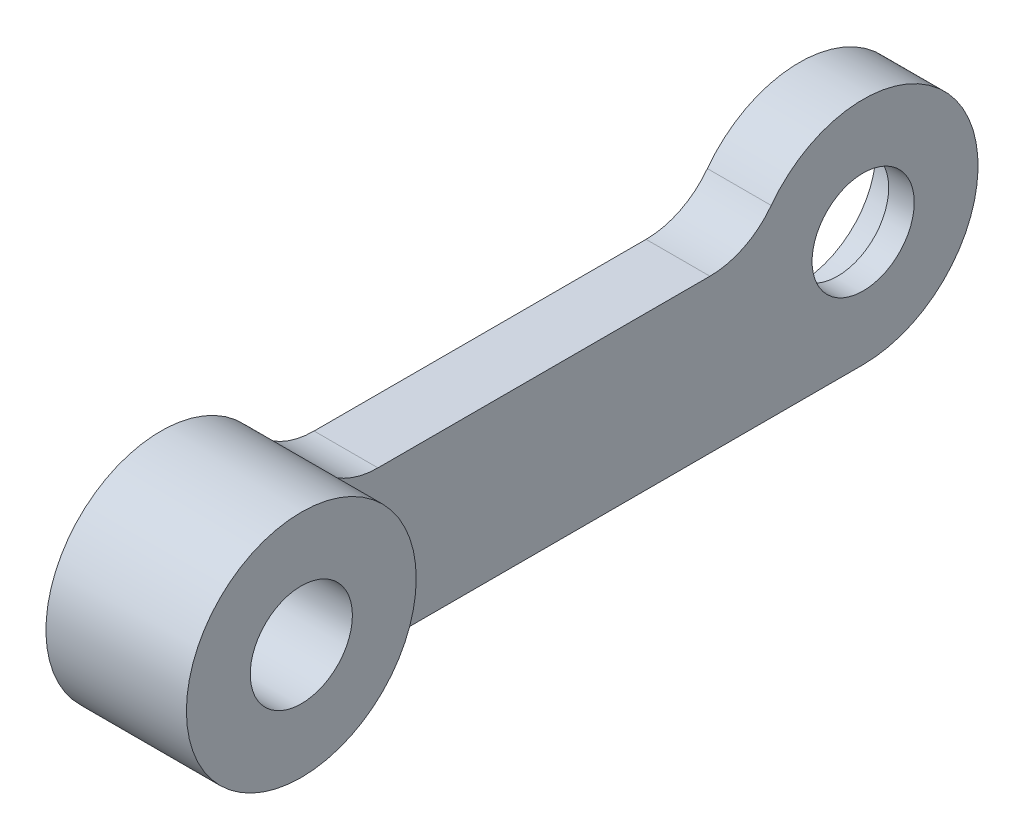
ISO-10303-21;
HEADER;
FILE_DESCRIPTION(('STEP AP214'),'2;1');
FILE_NAME('part.step','',(''),(''),'','','');
FILE_SCHEMA(('AUTOMOTIVE_DESIGN { 1 0 10303 214 1 1 1 1 }'));
ENDSEC;
DATA;
#1=APPLICATION_CONTEXT('core data for automotive mechanical design processes');
#2=APPLICATION_PROTOCOL_DEFINITION('international standard','automotive_design',2000,#1);
#3=PRODUCT_CONTEXT('',#1,'mechanical');
#4=PRODUCT('Part','Part','',(#3));
#5=PRODUCT_RELATED_PRODUCT_CATEGORY('part','',(#4));
#6=PRODUCT_DEFINITION_FORMATION('','',#4);
#7=PRODUCT_DEFINITION_CONTEXT('part definition',#1,'design');
#8=PRODUCT_DEFINITION('design','',#6,#7);
#9=PRODUCT_DEFINITION_SHAPE('','',#8);
#10=(LENGTH_UNIT() NAMED_UNIT(*) SI_UNIT(.MILLI.,.METRE.));
#11=(NAMED_UNIT(*) PLANE_ANGLE_UNIT() SI_UNIT($,.RADIAN.));
#12=(NAMED_UNIT(*) SI_UNIT($,.STERADIAN.) SOLID_ANGLE_UNIT());
#13=UNCERTAINTY_MEASURE_WITH_UNIT(LENGTH_MEASURE(1.E-05),#10,'distance_accuracy_value','');
#14=(GEOMETRIC_REPRESENTATION_CONTEXT(3) GLOBAL_UNCERTAINTY_ASSIGNED_CONTEXT((#13)) GLOBAL_UNIT_ASSIGNED_CONTEXT((#10,
#11,#12)) REPRESENTATION_CONTEXT('',''));
#15=CARTESIAN_POINT('',(0.,0.,0.));
#16=DIRECTION('',(0.,0.,1.));
#17=DIRECTION('',(1.,0.,0.));
#18=AXIS2_PLACEMENT_3D('',#15,#16,#17);
#19=CARTESIAN_POINT('',(4.5,-1.5,0.));
#20=DIRECTION('',(1.,0.,0.));
#21=DIRECTION('',(0.,0.,1.));
#22=AXIS2_PLACEMENT_3D('',#19,#20,#21);
#23=CYLINDRICAL_SURFACE('',#22,2.);
#24=CARTESIAN_POINT('',(10.,-1.5,0.));
#25=DIRECTION('',(1.,0.,0.));
#26=DIRECTION('',(0.,0.,-1.));
#27=AXIS2_PLACEMENT_3D('',#24,#25,#26);
#28=CIRCLE('',#27,2.);
#29=CARTESIAN_POINT('',(10.,-1.5,-2.));
#30=VERTEX_POINT('',#29);
#31=EDGE_CURVE('E162',#30,#30,#28,.T.);
#32=ORIENTED_EDGE('',*,*,#31,.T.);
#33=EDGE_LOOP('',(#32));
#34=FACE_BOUND('',#33,.T.);
#35=CARTESIAN_POINT('',(6.,-1.5,0.));
#36=DIRECTION('',(1.,0.,0.));
#37=DIRECTION('',(0.,0.,-1.));
#38=AXIS2_PLACEMENT_3D('',#35,#36,#37);
#39=CIRCLE('',#38,2.);
#40=CARTESIAN_POINT('',(6.,-1.5,-2.));
#41=VERTEX_POINT('',#40);
#42=EDGE_CURVE('E72',#41,#41,#39,.T.);
#43=ORIENTED_EDGE('',*,*,#42,.F.);
#44=EDGE_LOOP('',(#43));
#45=FACE_BOUND('',#44,.T.);
#46=ADVANCED_FACE('F68',(#34,#45),#23,.F.);
#47=CARTESIAN_POINT('',(4.5,-1.5,-25.));
#48=DIRECTION('',(1.,0.,0.));
#49=DIRECTION('',(0.,0.,1.));
#50=AXIS2_PLACEMENT_3D('',#47,#48,#49);
#51=CYLINDRICAL_SURFACE('',#50,2.);
#52=CARTESIAN_POINT('',(7.,-1.5,-25.));
#53=DIRECTION('',(1.,0.,0.));
#54=DIRECTION('',(0.,0.,-1.));
#55=AXIS2_PLACEMENT_3D('',#52,#53,#54);
#56=CIRCLE('',#55,2.);
#57=CARTESIAN_POINT('',(7.,-1.5,-27.));
#58=VERTEX_POINT('',#57);
#59=EDGE_CURVE('E159',#58,#58,#56,.F.);
#60=ORIENTED_EDGE('',*,*,#59,.F.);
#61=EDGE_LOOP('',(#60));
#62=FACE_BOUND('',#61,.T.);
#63=CARTESIAN_POINT('',(6.,-1.5,-25.));
#64=DIRECTION('',(1.,0.,0.));
#65=DIRECTION('',(0.,0.,-1.));
#66=AXIS2_PLACEMENT_3D('',#63,#64,#65);
#67=CIRCLE('',#66,2.);
#68=CARTESIAN_POINT('',(6.,-1.5,-27.));
#69=VERTEX_POINT('',#68);
#70=EDGE_CURVE('E175',#69,#69,#67,.T.);
#71=ORIENTED_EDGE('',*,*,#70,.F.);
#72=EDGE_LOOP('',(#71));
#73=FACE_BOUND('',#72,.T.);
#74=ADVANCED_FACE('F211',(#62,#73),#51,.F.);
#75=CARTESIAN_POINT('',(4.5,-1.5,0.));
#76=DIRECTION('',(-1.,0.,0.));
#77=DIRECTION('',(0.,0.,-1.));
#78=AXIS2_PLACEMENT_3D('',#75,#76,#77);
#79=PLANE('',#78);
#80=CARTESIAN_POINT('',(4.5,-1.5,0.));
#81=DIRECTION('',(1.,0.,0.));
#82=DIRECTION('',(0.,0.,-1.));
#83=AXIS2_PLACEMENT_3D('',#80,#81,#82);
#84=CIRCLE('',#83,3.);
#85=CARTESIAN_POINT('',(4.5,-1.5,-3.));
#86=VERTEX_POINT('',#85);
#87=EDGE_CURVE('E182',#86,#86,#84,.T.);
#88=ORIENTED_EDGE('',*,*,#87,.T.);
#89=EDGE_LOOP('',(#88));
#90=FACE_BOUND('',#89,.T.);
#91=CARTESIAN_POINT('',(4.5,-1.5,-25.));
#92=DIRECTION('',(1.,0.,0.));
#93=DIRECTION('',(0.,0.,-1.));
#94=AXIS2_PLACEMENT_3D('',#91,#92,#93);
#95=CIRCLE('',#94,3.);
#96=CARTESIAN_POINT('',(4.5,-1.5,-28.));
#97=VERTEX_POINT('',#96);
#98=EDGE_CURVE('E192',#97,#97,#95,.T.);
#99=ORIENTED_EDGE('',*,*,#98,.T.);
#100=EDGE_LOOP('',(#99));
#101=FACE_BOUND('',#100,.T.);
#102=DIRECTION('',(0.,0.,-1.));
#103=VECTOR('',#102,1.);
#104=CARTESIAN_POINT('',(4.5,-6.,0.));
#105=LINE('',#104,#103);
#106=CARTESIAN_POINT('',(4.5,-6.,0.));
#107=VERTEX_POINT('',#106);
#108=CARTESIAN_POINT('',(4.5,-6.,-25.));
#109=VERTEX_POINT('',#108);
#110=EDGE_CURVE('E146',#107,#109,#105,.T.);
#111=ORIENTED_EDGE('',*,*,#110,.F.);
#112=CARTESIAN_POINT('',(4.5,-1.5,0.));
#113=DIRECTION('',(1.,0.,0.));
#114=DIRECTION('',(0.,0.,-1.));
#115=AXIS2_PLACEMENT_3D('',#112,#113,#114);
#116=CIRCLE('',#115,4.5);
#117=CARTESIAN_POINT('',(4.5,1.2,-3.6));
#118=VERTEX_POINT('',#117);
#119=EDGE_CURVE('E141',#118,#107,#116,.T.);
#120=ORIENTED_EDGE('',*,*,#119,.F.);
#121=CARTESIAN_POINT('',(4.5,3.,-6.));
#122=DIRECTION('',(1.,0.,0.));
#123=DIRECTION('',(0.,0.,-1.));
#124=AXIS2_PLACEMENT_3D('',#121,#122,#123);
#125=CIRCLE('',#124,3.);
#126=CARTESIAN_POINT('',(4.5,0.,-6.));
#127=VERTEX_POINT('',#126);
#128=EDGE_CURVE('E12',#127,#118,#125,.F.);
#129=ORIENTED_EDGE('',*,*,#128,.F.);
#130=DIRECTION('',(0.,0.,-1.));
#131=VECTOR('',#130,1.);
#132=CARTESIAN_POINT('',(4.5,0.,0.));
#133=LINE('',#132,#131);
#134=CARTESIAN_POINT('',(4.5,0.,-19.));
#135=VERTEX_POINT('',#134);
#136=EDGE_CURVE('E148',#127,#135,#133,.T.);
#137=ORIENTED_EDGE('',*,*,#136,.T.);
#138=CARTESIAN_POINT('',(4.5,3.,-19.));
#139=DIRECTION('',(1.,0.,0.));
#140=DIRECTION('',(0.,0.,-1.));
#141=AXIS2_PLACEMENT_3D('',#138,#139,#140);
#142=CIRCLE('',#141,3.);
#143=CARTESIAN_POINT('',(4.5,1.2,-21.4));
#144=VERTEX_POINT('',#143);
#145=EDGE_CURVE('E172',#144,#135,#142,.F.);
#146=ORIENTED_EDGE('',*,*,#145,.F.);
#147=CARTESIAN_POINT('',(4.5,-1.5,-25.));
#148=DIRECTION('',(1.,0.,0.));
#149=DIRECTION('',(0.,0.,-1.));
#150=AXIS2_PLACEMENT_3D('',#147,#148,#149);
#151=CIRCLE('',#150,4.5);
#152=EDGE_CURVE('E132',#109,#144,#151,.T.);
#153=ORIENTED_EDGE('',*,*,#152,.F.);
#154=EDGE_LOOP('',(#111,#120,#129,#137,#146,#153));
#155=FACE_BOUND('',#154,.T.);
#156=ADVANCED_FACE('F202',(#90,#101,#155),#79,.T.);
#157=CARTESIAN_POINT('',(4.5,-1.5,0.));
#158=DIRECTION('',(1.,0.,0.));
#159=DIRECTION('',(0.,0.,1.));
#160=AXIS2_PLACEMENT_3D('',#157,#158,#159);
#161=CYLINDRICAL_SURFACE('',#160,4.5);
#162=ORIENTED_EDGE('',*,*,#119,.T.);
#163=DIRECTION('',(1.,0.,0.));
#164=VECTOR('',#163,1.);
#165=CARTESIAN_POINT('',(4.5,-6.,0.));
#166=LINE('',#165,#164);
#167=CARTESIAN_POINT('',(7.,-6.,0.));
#168=VERTEX_POINT('',#167);
#169=EDGE_CURVE('E127',#107,#168,#166,.T.);
#170=ORIENTED_EDGE('',*,*,#169,.T.);
#171=CARTESIAN_POINT('',(7.,-1.5,0.));
#172=DIRECTION('',(1.,0.,0.));
#173=DIRECTION('',(0.,0.,-1.));
#174=AXIS2_PLACEMENT_3D('',#171,#172,#173);
#175=CIRCLE('',#174,4.5);
#176=CARTESIAN_POINT('',(7.,1.2,-3.6));
#177=VERTEX_POINT('',#176);
#178=EDGE_CURVE('E134',#168,#177,#175,.T.);
#179=ORIENTED_EDGE('',*,*,#178,.T.);
#180=DIRECTION('',(1.,0.,0.));
#181=VECTOR('',#180,1.);
#182=CARTESIAN_POINT('',(4.5,1.2,-3.6));
#183=LINE('',#182,#181);
#184=EDGE_CURVE('E91',#118,#177,#183,.T.);
#185=ORIENTED_EDGE('',*,*,#184,.F.);
#186=EDGE_LOOP('',(#162,#170,#179,#185));
#187=FACE_BOUND('',#186,.T.);
#188=CARTESIAN_POINT('',(10.,-1.5,0.));
#189=DIRECTION('',(1.,0.,0.));
#190=DIRECTION('',(0.,0.,-1.));
#191=AXIS2_PLACEMENT_3D('',#188,#189,#190);
#192=CIRCLE('',#191,4.5);
#193=CARTESIAN_POINT('',(10.,-1.5,-4.5));
#194=VERTEX_POINT('',#193);
#195=EDGE_CURVE('E158',#194,#194,#192,.T.);
#196=ORIENTED_EDGE('',*,*,#195,.F.);
#197=EDGE_LOOP('',(#196));
#198=FACE_BOUND('',#197,.T.);
#199=ADVANCED_FACE('F138',(#187,#198),#161,.T.);
#200=CARTESIAN_POINT('',(7.,-1.5,0.));
#201=DIRECTION('',(-1.,0.,0.));
#202=DIRECTION('',(0.,0.,-1.));
#203=AXIS2_PLACEMENT_3D('',#200,#201,#202);
#204=PLANE('',#203);
#205=ORIENTED_EDGE('',*,*,#59,.T.);
#206=EDGE_LOOP('',(#205));
#207=FACE_BOUND('',#206,.T.);
#208=DIRECTION('',(0.,0.,-1.));
#209=VECTOR('',#208,1.);
#210=CARTESIAN_POINT('',(7.,-6.,0.));
#211=LINE('',#210,#209);
#212=CARTESIAN_POINT('',(7.,-6.,-25.));
#213=VERTEX_POINT('',#212);
#214=EDGE_CURVE('E123',#168,#213,#211,.T.);
#215=ORIENTED_EDGE('',*,*,#214,.T.);
#216=CARTESIAN_POINT('',(7.,-1.5,-25.));
#217=DIRECTION('',(1.,0.,0.));
#218=DIRECTION('',(0.,0.,-1.));
#219=AXIS2_PLACEMENT_3D('',#216,#217,#218);
#220=CIRCLE('',#219,4.5);
#221=CARTESIAN_POINT('',(7.,1.2,-21.4));
#222=VERTEX_POINT('',#221);
#223=EDGE_CURVE('E156',#213,#222,#220,.T.);
#224=ORIENTED_EDGE('',*,*,#223,.T.);
#225=CARTESIAN_POINT('',(7.,3.,-19.));
#226=DIRECTION('',(1.,0.,0.));
#227=DIRECTION('',(0.,0.,-1.));
#228=AXIS2_PLACEMENT_3D('',#225,#226,#227);
#229=CIRCLE('',#228,3.);
#230=CARTESIAN_POINT('',(7.,0.,-19.));
#231=VERTEX_POINT('',#230);
#232=EDGE_CURVE('E169',#231,#222,#229,.T.);
#233=ORIENTED_EDGE('',*,*,#232,.F.);
#234=DIRECTION('',(0.,0.,-1.));
#235=VECTOR('',#234,1.);
#236=CARTESIAN_POINT('',(7.,0.,0.));
#237=LINE('',#236,#235);
#238=CARTESIAN_POINT('',(7.,0.,-6.));
#239=VERTEX_POINT('',#238);
#240=EDGE_CURVE('E131',#239,#231,#237,.T.);
#241=ORIENTED_EDGE('',*,*,#240,.F.);
#242=CARTESIAN_POINT('',(7.,3.,-6.));
#243=DIRECTION('',(1.,0.,0.));
#244=DIRECTION('',(0.,0.,-1.));
#245=AXIS2_PLACEMENT_3D('',#242,#243,#244);
#246=CIRCLE('',#245,3.);
#247=EDGE_CURVE('E77',#177,#239,#246,.T.);
#248=ORIENTED_EDGE('',*,*,#247,.F.);
#249=ORIENTED_EDGE('',*,*,#178,.F.);
#250=EDGE_LOOP('',(#215,#224,#233,#241,#248,#249));
#251=FACE_BOUND('',#250,.T.);
#252=ADVANCED_FACE('F135',(#207,#251),#204,.F.);
#253=CARTESIAN_POINT('',(4.5,-1.5,-25.));
#254=DIRECTION('',(1.,0.,0.));
#255=DIRECTION('',(0.,0.,1.));
#256=AXIS2_PLACEMENT_3D('',#253,#254,#255);
#257=CYLINDRICAL_SURFACE('',#256,4.5);
#258=ORIENTED_EDGE('',*,*,#223,.F.);
#259=DIRECTION('',(1.,0.,0.));
#260=VECTOR('',#259,1.);
#261=CARTESIAN_POINT('',(4.5,-6.,-25.));
#262=LINE('',#261,#260);
#263=EDGE_CURVE('E128',#109,#213,#262,.T.);
#264=ORIENTED_EDGE('',*,*,#263,.F.);
#265=ORIENTED_EDGE('',*,*,#152,.T.);
#266=DIRECTION('',(1.,0.,0.));
#267=VECTOR('',#266,1.);
#268=CARTESIAN_POINT('',(4.5,1.2,-21.4));
#269=LINE('',#268,#267);
#270=EDGE_CURVE('E166',#222,#144,#269,.F.);
#271=ORIENTED_EDGE('',*,*,#270,.F.);
#272=EDGE_LOOP('',(#258,#264,#265,#271));
#273=FACE_BOUND('',#272,.T.);
#274=ADVANCED_FACE('F208',(#273),#257,.T.);
#275=CARTESIAN_POINT('',(4.5,0.,0.));
#276=DIRECTION('',(0.,1.,0.));
#277=DIRECTION('',(0.,0.,1.));
#278=AXIS2_PLACEMENT_3D('',#275,#276,#277);
#279=PLANE('',#278);
#280=ORIENTED_EDGE('',*,*,#136,.F.);
#281=DIRECTION('',(1.,0.,0.));
#282=VECTOR('',#281,1.);
#283=CARTESIAN_POINT('',(4.5,0.,-6.));
#284=LINE('',#283,#282);
#285=EDGE_CURVE('E136',#239,#127,#284,.F.);
#286=ORIENTED_EDGE('',*,*,#285,.F.);
#287=ORIENTED_EDGE('',*,*,#240,.T.);
#288=DIRECTION('',(1.,0.,0.));
#289=VECTOR('',#288,1.);
#290=CARTESIAN_POINT('',(4.5,0.,-19.));
#291=LINE('',#290,#289);
#292=EDGE_CURVE('E164',#135,#231,#291,.T.);
#293=ORIENTED_EDGE('',*,*,#292,.F.);
#294=EDGE_LOOP('',(#280,#286,#287,#293));
#295=FACE_BOUND('',#294,.T.);
#296=ADVANCED_FACE('F236',(#295),#279,.T.);
#297=CARTESIAN_POINT('',(4.5,-6.,0.));
#298=DIRECTION('',(0.,1.,0.));
#299=DIRECTION('',(0.,0.,1.));
#300=AXIS2_PLACEMENT_3D('',#297,#298,#299);
#301=PLANE('',#300);
#302=ORIENTED_EDGE('',*,*,#214,.F.);
#303=ORIENTED_EDGE('',*,*,#169,.F.);
#304=ORIENTED_EDGE('',*,*,#110,.T.);
#305=ORIENTED_EDGE('',*,*,#263,.T.);
#306=EDGE_LOOP('',(#302,#303,#304,#305));
#307=FACE_BOUND('',#306,.T.);
#308=ADVANCED_FACE('F124',(#307),#301,.F.);
#309=CARTESIAN_POINT('',(10.,-1.5,0.));
#310=DIRECTION('',(-1.,0.,0.));
#311=DIRECTION('',(0.,0.,-1.));
#312=AXIS2_PLACEMENT_3D('',#309,#310,#311);
#313=PLANE('',#312);
#314=ORIENTED_EDGE('',*,*,#31,.F.);
#315=EDGE_LOOP('',(#314));
#316=FACE_BOUND('',#315,.T.);
#317=ORIENTED_EDGE('',*,*,#195,.T.);
#318=EDGE_LOOP('',(#317));
#319=FACE_BOUND('',#318,.T.);
#320=ADVANCED_FACE('F200',(#316,#319),#313,.F.);
#321=CARTESIAN_POINT('',(4.5,3.,-19.));
#322=DIRECTION('',(1.,0.,0.));
#323=DIRECTION('',(0.,0.,1.));
#324=AXIS2_PLACEMENT_3D('',#321,#322,#323);
#325=CYLINDRICAL_SURFACE('',#324,3.);
#326=ORIENTED_EDGE('',*,*,#145,.T.);
#327=ORIENTED_EDGE('',*,*,#292,.T.);
#328=ORIENTED_EDGE('',*,*,#232,.T.);
#329=ORIENTED_EDGE('',*,*,#270,.T.);
#330=EDGE_LOOP('',(#326,#327,#328,#329));
#331=FACE_BOUND('',#330,.T.);
#332=ADVANCED_FACE('F229',(#331),#325,.F.);
#333=CARTESIAN_POINT('',(4.5,3.,-6.));
#334=DIRECTION('',(1.,0.,0.));
#335=DIRECTION('',(0.,0.,1.));
#336=AXIS2_PLACEMENT_3D('',#333,#334,#335);
#337=CYLINDRICAL_SURFACE('',#336,3.);
#338=ORIENTED_EDGE('',*,*,#128,.T.);
#339=ORIENTED_EDGE('',*,*,#184,.T.);
#340=ORIENTED_EDGE('',*,*,#247,.T.);
#341=ORIENTED_EDGE('',*,*,#285,.T.);
#342=EDGE_LOOP('',(#338,#339,#340,#341));
#343=FACE_BOUND('',#342,.T.);
#344=ADVANCED_FACE('F70',(#343),#337,.F.);
#345=CARTESIAN_POINT('',(6.,-1.5,-25.));
#346=DIRECTION('',(-1.,0.,0.));
#347=DIRECTION('',(0.,0.,-1.));
#348=AXIS2_PLACEMENT_3D('',#345,#346,#347);
#349=CYLINDRICAL_SURFACE('',#348,3.);
#350=CARTESIAN_POINT('',(6.,-1.5,-25.));
#351=DIRECTION('',(1.,0.,0.));
#352=DIRECTION('',(0.,0.,-1.));
#353=AXIS2_PLACEMENT_3D('',#350,#351,#352);
#354=CIRCLE('',#353,3.);
#355=CARTESIAN_POINT('',(6.,-1.5,-28.));
#356=VERTEX_POINT('',#355);
#357=EDGE_CURVE('E187',#356,#356,#354,.T.);
#358=ORIENTED_EDGE('',*,*,#357,.T.);
#359=EDGE_LOOP('',(#358));
#360=FACE_BOUND('',#359,.T.);
#361=ORIENTED_EDGE('',*,*,#98,.F.);
#362=EDGE_LOOP('',(#361));
#363=FACE_BOUND('',#362,.T.);
#364=ADVANCED_FACE('F225',(#360,#363),#349,.F.);
#365=CARTESIAN_POINT('',(6.,-1.5,-25.));
#366=DIRECTION('',(-1.,0.,0.));
#367=DIRECTION('',(0.,0.,-1.));
#368=AXIS2_PLACEMENT_3D('',#365,#366,#367);
#369=PLANE('',#368);
#370=ORIENTED_EDGE('',*,*,#70,.T.);
#371=EDGE_LOOP('',(#370));
#372=FACE_BOUND('',#371,.T.);
#373=ORIENTED_EDGE('',*,*,#357,.F.);
#374=EDGE_LOOP('',(#373));
#375=FACE_BOUND('',#374,.T.);
#376=ADVANCED_FACE('F259',(#372,#375),#369,.T.);
#377=CARTESIAN_POINT('',(6.,-1.5,0.));
#378=DIRECTION('',(-1.,0.,0.));
#379=DIRECTION('',(0.,0.,-1.));
#380=AXIS2_PLACEMENT_3D('',#377,#378,#379);
#381=CYLINDRICAL_SURFACE('',#380,3.);
#382=CARTESIAN_POINT('',(6.,-1.5,0.));
#383=DIRECTION('',(1.,0.,0.));
#384=DIRECTION('',(0.,0.,-1.));
#385=AXIS2_PLACEMENT_3D('',#382,#383,#384);
#386=CIRCLE('',#385,3.);
#387=CARTESIAN_POINT('',(6.,-1.5,-3.));
#388=VERTEX_POINT('',#387);
#389=EDGE_CURVE('E177',#388,#388,#386,.T.);
#390=ORIENTED_EDGE('',*,*,#389,.T.);
#391=EDGE_LOOP('',(#390));
#392=FACE_BOUND('',#391,.T.);
#393=ORIENTED_EDGE('',*,*,#87,.F.);
#394=EDGE_LOOP('',(#393));
#395=FACE_BOUND('',#394,.T.);
#396=ADVANCED_FACE('F264',(#392,#395),#381,.F.);
#397=CARTESIAN_POINT('',(6.,-1.5,0.));
#398=DIRECTION('',(-1.,0.,0.));
#399=DIRECTION('',(0.,0.,-1.));
#400=AXIS2_PLACEMENT_3D('',#397,#398,#399);
#401=PLANE('',#400);
#402=ORIENTED_EDGE('',*,*,#42,.T.);
#403=EDGE_LOOP('',(#402));
#404=FACE_BOUND('',#403,.T.);
#405=ORIENTED_EDGE('',*,*,#389,.F.);
#406=EDGE_LOOP('',(#405));
#407=FACE_BOUND('',#406,.T.);
#408=ADVANCED_FACE('F273',(#404,#407),#401,.T.);
#409=CLOSED_SHELL('',(#46,#74,#156,#199,#252,#274,#296,#308,#320,#332,#344,#364,#376,#396,#408));
#410=MANIFOLD_SOLID_BREP('B2',#409);
#411=ADVANCED_BREP_SHAPE_REPRESENTATION('',(#18,#410),#14);
#412=SHAPE_DEFINITION_REPRESENTATION(#9,#411);
ENDSEC;
END-ISO-10303-21;
